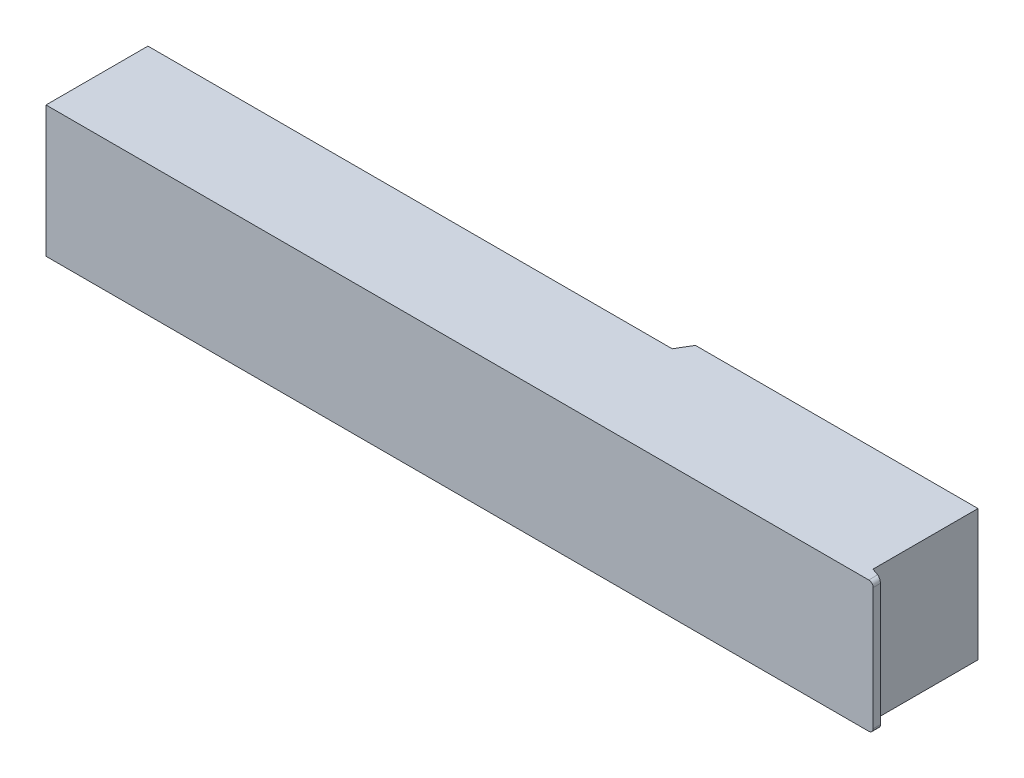
ISO-10303-21;
HEADER;
FILE_DESCRIPTION(('STEP AP214'),'2;1');
FILE_NAME('part.step','',(''),(''),'','','');
FILE_SCHEMA(('AUTOMOTIVE_DESIGN { 1 0 10303 214 1 1 1 1 }'));
ENDSEC;
DATA;
#1=APPLICATION_CONTEXT('core data for automotive mechanical design processes');
#2=APPLICATION_PROTOCOL_DEFINITION('international standard','automotive_design',2000,#1);
#3=PRODUCT_CONTEXT('',#1,'mechanical');
#4=PRODUCT('Part','Part','',(#3));
#5=PRODUCT_RELATED_PRODUCT_CATEGORY('part','',(#4));
#6=PRODUCT_DEFINITION_FORMATION('','',#4);
#7=PRODUCT_DEFINITION_CONTEXT('part definition',#1,'design');
#8=PRODUCT_DEFINITION('design','',#6,#7);
#9=PRODUCT_DEFINITION_SHAPE('','',#8);
#10=(LENGTH_UNIT() NAMED_UNIT(*) SI_UNIT(.MILLI.,.METRE.));
#11=(NAMED_UNIT(*) PLANE_ANGLE_UNIT() SI_UNIT($,.RADIAN.));
#12=(NAMED_UNIT(*) SI_UNIT($,.STERADIAN.) SOLID_ANGLE_UNIT());
#13=UNCERTAINTY_MEASURE_WITH_UNIT(LENGTH_MEASURE(1.E-05),#10,'distance_accuracy_value','');
#14=(GEOMETRIC_REPRESENTATION_CONTEXT(3) GLOBAL_UNCERTAINTY_ASSIGNED_CONTEXT((#13)) GLOBAL_UNIT_ASSIGNED_CONTEXT((#10,
#11,#12)) REPRESENTATION_CONTEXT('',''));
#15=CARTESIAN_POINT('',(0.,0.,0.));
#16=DIRECTION('',(0.,0.,1.));
#17=DIRECTION('',(1.,0.,0.));
#18=AXIS2_PLACEMENT_3D('',#15,#16,#17);
#19=CARTESIAN_POINT('',(0.,22.5,-20.));
#20=DIRECTION('',(0.,-1.,0.));
#21=DIRECTION('',(1.,0.,0.));
#22=AXIS2_PLACEMENT_3D('',#19,#20,#21);
#23=PLANE('',#22);
#24=DIRECTION('',(1.,0.,0.));
#25=VECTOR('',#24,1.);
#26=CARTESIAN_POINT('',(0.,22.5,-17.5));
#27=LINE('',#26,#25);
#28=CARTESIAN_POINT('',(0.,22.5,-17.5));
#29=VERTEX_POINT('',#28);
#30=CARTESIAN_POINT('',(90.,22.5,-17.5));
#31=VERTEX_POINT('',#30);
#32=EDGE_CURVE('E125',#29,#31,#27,.T.);
#33=ORIENTED_EDGE('',*,*,#32,.F.);
#34=DIRECTION('',(0.,0.,1.));
#35=VECTOR('',#34,1.);
#36=CARTESIAN_POINT('',(0.,22.5,-20.));
#37=LINE('',#36,#35);
#38=CARTESIAN_POINT('',(0.,22.5,0.));
#39=VERTEX_POINT('',#38);
#40=EDGE_CURVE('E181',#29,#39,#37,.T.);
#41=ORIENTED_EDGE('',*,*,#40,.T.);
#42=DIRECTION('',(1.,0.,0.));
#43=VECTOR('',#42,1.);
#44=CARTESIAN_POINT('',(0.,22.5,0.));
#45=LINE('',#44,#43);
#46=CARTESIAN_POINT('',(141.25,22.5,0.));
#47=VERTEX_POINT('',#46);
#48=EDGE_CURVE('E169',#39,#47,#45,.T.);
#49=ORIENTED_EDGE('',*,*,#48,.T.);
#50=DIRECTION('',(0.,0.,1.));
#51=VECTOR('',#50,1.);
#52=CARTESIAN_POINT('',(141.25,22.5,-1.24999999999999));
#53=LINE('',#52,#51);
#54=CARTESIAN_POINT('',(141.25,22.5,-1.52297767569964));
#55=VERTEX_POINT('',#54);
#56=EDGE_CURVE('E70',#47,#55,#53,.F.);
#57=ORIENTED_EDGE('',*,*,#56,.T.);
#58=DIRECTION('',(0.939692620785909,0.,0.342020143325667));
#59=VECTOR('',#58,1.);
#60=CARTESIAN_POINT('',(142.,22.5,-1.24999999999999));
#61=LINE('',#60,#59);
#62=CARTESIAN_POINT('',(140.,22.5,-1.97794046853239));
#63=VERTEX_POINT('',#62);
#64=EDGE_CURVE('E188',#55,#63,#61,.F.);
#65=ORIENTED_EDGE('',*,*,#64,.T.);
#66=DIRECTION('',(0.,0.,1.));
#67=VECTOR('',#66,1.);
#68=CARTESIAN_POINT('',(140.,22.5,-20.));
#69=LINE('',#68,#67);
#70=CARTESIAN_POINT('',(140.,22.5,-20.));
#71=VERTEX_POINT('',#70);
#72=EDGE_CURVE('E150',#71,#63,#69,.T.);
#73=ORIENTED_EDGE('',*,*,#72,.F.);
#74=DIRECTION('',(1.,0.,0.));
#75=VECTOR('',#74,1.);
#76=CARTESIAN_POINT('',(0.,22.5,-20.));
#77=LINE('',#76,#75);
#78=CARTESIAN_POINT('',(91.5,22.5,-20.));
#79=VERTEX_POINT('',#78);
#80=EDGE_CURVE('E142',#79,#71,#77,.T.);
#81=ORIENTED_EDGE('',*,*,#80,.F.);
#82=DIRECTION('',(0.51449575542753,0.,-0.857492925712542));
#83=VECTOR('',#82,1.);
#84=CARTESIAN_POINT('',(67.2794117647055,22.5,20.3676470588237));
#85=LINE('',#84,#83);
#86=EDGE_CURVE('E135',#31,#79,#85,.T.);
#87=ORIENTED_EDGE('',*,*,#86,.F.);
#88=EDGE_LOOP('',(#33,#41,#49,#57,#65,#73,#81,#87));
#89=FACE_BOUND('',#88,.T.);
#90=ADVANCED_FACE('F46',(#89),#23,.F.);
#91=CARTESIAN_POINT('',(0.,0.,-20.));
#92=DIRECTION('',(0.,-1.,0.));
#93=DIRECTION('',(1.,0.,0.));
#94=AXIS2_PLACEMENT_3D('',#91,#92,#93);
#95=PLANE('',#94);
#96=DIRECTION('',(0.,0.,1.));
#97=VECTOR('',#96,1.);
#98=CARTESIAN_POINT('',(0.,0.,-20.));
#99=LINE('',#98,#97);
#100=CARTESIAN_POINT('',(0.,0.,-17.5));
#101=VERTEX_POINT('',#100);
#102=CARTESIAN_POINT('',(0.,0.,0.));
#103=VERTEX_POINT('',#102);
#104=EDGE_CURVE('E165',#101,#103,#99,.T.);
#105=ORIENTED_EDGE('',*,*,#104,.F.);
#106=DIRECTION('',(1.,0.,0.));
#107=VECTOR('',#106,1.);
#108=CARTESIAN_POINT('',(0.,0.,-17.5));
#109=LINE('',#108,#107);
#110=CARTESIAN_POINT('',(90.,0.,-17.5));
#111=VERTEX_POINT('',#110);
#112=EDGE_CURVE('E11',#101,#111,#109,.T.);
#113=ORIENTED_EDGE('',*,*,#112,.T.);
#114=DIRECTION('',(0.51449575542753,0.,-0.857492925712542));
#115=VECTOR('',#114,1.);
#116=CARTESIAN_POINT('',(67.2794117647055,0.,20.3676470588237));
#117=LINE('',#116,#115);
#118=CARTESIAN_POINT('',(91.5,0.,-20.));
#119=VERTEX_POINT('',#118);
#120=EDGE_CURVE('E55',#111,#119,#117,.T.);
#121=ORIENTED_EDGE('',*,*,#120,.T.);
#122=DIRECTION('',(1.,0.,0.));
#123=VECTOR('',#122,1.);
#124=CARTESIAN_POINT('',(0.,0.,-20.));
#125=LINE('',#124,#123);
#126=CARTESIAN_POINT('',(140.,0.,-20.));
#127=VERTEX_POINT('',#126);
#128=EDGE_CURVE('E161',#119,#127,#125,.T.);
#129=ORIENTED_EDGE('',*,*,#128,.T.);
#130=DIRECTION('',(0.,0.,1.));
#131=VECTOR('',#130,1.);
#132=CARTESIAN_POINT('',(140.,0.,-20.));
#133=LINE('',#132,#131);
#134=CARTESIAN_POINT('',(140.,0.,-1.97794046853239));
#135=VERTEX_POINT('',#134);
#136=EDGE_CURVE('E134',#127,#135,#133,.T.);
#137=ORIENTED_EDGE('',*,*,#136,.T.);
#138=DIRECTION('',(-0.939692620785909,0.,-0.342020143325667));
#139=VECTOR('',#138,1.);
#140=CARTESIAN_POINT('',(10.5847106977411,0.,-49.0812536335036));
#141=LINE('',#140,#139);
#142=CARTESIAN_POINT('',(141.25,0.,-1.52297767569964));
#143=VERTEX_POINT('',#142);
#144=EDGE_CURVE('E191',#135,#143,#141,.F.);
#145=ORIENTED_EDGE('',*,*,#144,.T.);
#146=DIRECTION('',(0.,0.,1.));
#147=VECTOR('',#146,1.);
#148=CARTESIAN_POINT('',(141.25,0.,-20.));
#149=LINE('',#148,#147);
#150=CARTESIAN_POINT('',(141.25,0.,0.));
#151=VERTEX_POINT('',#150);
#152=EDGE_CURVE('E199',#143,#151,#149,.T.);
#153=ORIENTED_EDGE('',*,*,#152,.T.);
#154=DIRECTION('',(1.,0.,0.));
#155=VECTOR('',#154,1.);
#156=CARTESIAN_POINT('',(0.,0.,0.));
#157=LINE('',#156,#155);
#158=EDGE_CURVE('E162',#103,#151,#157,.T.);
#159=ORIENTED_EDGE('',*,*,#158,.F.);
#160=EDGE_LOOP('',(#105,#113,#121,#129,#137,#145,#153,#159));
#161=FACE_BOUND('',#160,.T.);
#162=ADVANCED_FACE('F227',(#161),#95,.T.);
#163=CARTESIAN_POINT('',(142.,0.,-20.));
#164=DIRECTION('',(1.,0.,0.));
#165=DIRECTION('',(0.,0.,-1.));
#166=AXIS2_PLACEMENT_3D('',#163,#164,#165);
#167=PLANE('',#166);
#168=DIRECTION('',(0.,1.,0.));
#169=VECTOR('',#168,1.);
#170=CARTESIAN_POINT('',(142.,0.,0.));
#171=LINE('',#170,#169);
#172=CARTESIAN_POINT('',(142.,0.750000000000017,0.));
#173=VERTEX_POINT('',#172);
#174=CARTESIAN_POINT('',(142.,21.75,0.));
#175=VERTEX_POINT('',#174);
#176=EDGE_CURVE('E172',#173,#175,#171,.T.);
#177=ORIENTED_EDGE('',*,*,#176,.F.);
#178=DIRECTION('',(0.,0.,1.));
#179=VECTOR('',#178,1.);
#180=CARTESIAN_POINT('',(142.,0.750000000000017,-20.));
#181=LINE('',#180,#179);
#182=CARTESIAN_POINT('',(142.,0.750000000000017,-1.24999999999999));
#183=VERTEX_POINT('',#182);
#184=EDGE_CURVE('E213',#173,#183,#181,.F.);
#185=ORIENTED_EDGE('',*,*,#184,.T.);
#186=DIRECTION('',(0.,1.,0.));
#187=VECTOR('',#186,1.);
#188=CARTESIAN_POINT('',(142.,0.,-1.24999999999999));
#189=LINE('',#188,#187);
#190=CARTESIAN_POINT('',(142.,21.75,-1.24999999999999));
#191=VERTEX_POINT('',#190);
#192=EDGE_CURVE('E184',#183,#191,#189,.T.);
#193=ORIENTED_EDGE('',*,*,#192,.T.);
#194=DIRECTION('',(0.,0.,1.));
#195=VECTOR('',#194,1.);
#196=CARTESIAN_POINT('',(142.,21.75,0.));
#197=LINE('',#196,#195);
#198=EDGE_CURVE('E209',#191,#175,#197,.T.);
#199=ORIENTED_EDGE('',*,*,#198,.T.);
#200=EDGE_LOOP('',(#177,#185,#193,#199));
#201=FACE_BOUND('',#200,.T.);
#202=ADVANCED_FACE('F244',(#201),#167,.T.);
#203=CARTESIAN_POINT('',(0.,0.,-20.));
#204=DIRECTION('',(1.,0.,0.));
#205=DIRECTION('',(0.,0.,-1.));
#206=AXIS2_PLACEMENT_3D('',#203,#204,#205);
#207=PLANE('',#206);
#208=ORIENTED_EDGE('',*,*,#40,.F.);
#209=DIRECTION('',(0.,-1.,0.));
#210=VECTOR('',#209,1.);
#211=CARTESIAN_POINT('',(0.,203.944938273295,-17.5));
#212=LINE('',#211,#210);
#213=EDGE_CURVE('E130',#29,#101,#212,.T.);
#214=ORIENTED_EDGE('',*,*,#213,.T.);
#215=ORIENTED_EDGE('',*,*,#104,.T.);
#216=DIRECTION('',(0.,1.,0.));
#217=VECTOR('',#216,1.);
#218=CARTESIAN_POINT('',(0.,0.,0.));
#219=LINE('',#218,#217);
#220=EDGE_CURVE('E158',#103,#39,#219,.T.);
#221=ORIENTED_EDGE('',*,*,#220,.T.);
#222=EDGE_LOOP('',(#208,#214,#215,#221));
#223=FACE_BOUND('',#222,.T.);
#224=ADVANCED_FACE('F256',(#223),#207,.F.);
#225=CARTESIAN_POINT('',(0.,0.,-20.));
#226=DIRECTION('',(0.,0.,-1.));
#227=DIRECTION('',(-1.,0.,0.));
#228=AXIS2_PLACEMENT_3D('',#225,#226,#227);
#229=PLANE('',#228);
#230=DIRECTION('',(0.,-1.,0.));
#231=VECTOR('',#230,1.);
#232=CARTESIAN_POINT('',(91.5,203.944938273295,-20.));
#233=LINE('',#232,#231);
#234=EDGE_CURVE('E62',#79,#119,#233,.T.);
#235=ORIENTED_EDGE('',*,*,#234,.F.);
#236=ORIENTED_EDGE('',*,*,#80,.T.);
#237=DIRECTION('',(0.,1.,0.));
#238=VECTOR('',#237,1.);
#239=CARTESIAN_POINT('',(140.,0.,-20.));
#240=LINE('',#239,#238);
#241=EDGE_CURVE('E154',#127,#71,#240,.T.);
#242=ORIENTED_EDGE('',*,*,#241,.F.);
#243=ORIENTED_EDGE('',*,*,#128,.F.);
#244=EDGE_LOOP('',(#235,#236,#242,#243));
#245=FACE_BOUND('',#244,.T.);
#246=ADVANCED_FACE('F231',(#245),#229,.T.);
#247=CARTESIAN_POINT('',(0.,0.,0.));
#248=DIRECTION('',(0.,0.,-1.));
#249=DIRECTION('',(-1.,0.,0.));
#250=AXIS2_PLACEMENT_3D('',#247,#248,#249);
#251=PLANE('',#250);
#252=ORIENTED_EDGE('',*,*,#158,.T.);
#253=CARTESIAN_POINT('',(141.25,0.750000000000017,0.));
#254=DIRECTION('',(0.,0.,-1.));
#255=DIRECTION('',(-1.,0.,0.));
#256=AXIS2_PLACEMENT_3D('',#253,#254,#255);
#257=CIRCLE('',#256,0.75);
#258=EDGE_CURVE('E206',#151,#173,#257,.F.);
#259=ORIENTED_EDGE('',*,*,#258,.T.);
#260=ORIENTED_EDGE('',*,*,#176,.T.);
#261=CARTESIAN_POINT('',(141.25,21.75,0.));
#262=DIRECTION('',(0.,0.,-1.));
#263=DIRECTION('',(-1.,0.,0.));
#264=AXIS2_PLACEMENT_3D('',#261,#262,#263);
#265=CIRCLE('',#264,0.75);
#266=EDGE_CURVE('E203',#175,#47,#265,.F.);
#267=ORIENTED_EDGE('',*,*,#266,.T.);
#268=ORIENTED_EDGE('',*,*,#48,.F.);
#269=ORIENTED_EDGE('',*,*,#220,.F.);
#270=EDGE_LOOP('',(#252,#259,#260,#267,#268,#269));
#271=FACE_BOUND('',#270,.T.);
#272=ADVANCED_FACE('F247',(#271),#251,.F.);
#273=CARTESIAN_POINT('',(140.,0.,0.));
#274=DIRECTION('',(-1.,0.,0.));
#275=DIRECTION('',(0.,0.,1.));
#276=AXIS2_PLACEMENT_3D('',#273,#274,#275);
#277=PLANE('',#276);
#278=ORIENTED_EDGE('',*,*,#136,.F.);
#279=ORIENTED_EDGE('',*,*,#241,.T.);
#280=ORIENTED_EDGE('',*,*,#72,.T.);
#281=DIRECTION('',(0.,1.,0.));
#282=VECTOR('',#281,1.);
#283=CARTESIAN_POINT('',(140.,0.,-1.97794046853239));
#284=LINE('',#283,#282);
#285=EDGE_CURVE('E195',#63,#135,#284,.F.);
#286=ORIENTED_EDGE('',*,*,#285,.T.);
#287=EDGE_LOOP('',(#278,#279,#280,#286));
#288=FACE_BOUND('',#287,.T.);
#289=ADVANCED_FACE('F233',(#288),#277,.F.);
#290=CARTESIAN_POINT('',(142.,0.,-1.24999999999999));
#291=DIRECTION('',(-0.342020143325667,0.,0.939692620785909));
#292=DIRECTION('',(0.,1.,0.));
#293=AXIS2_PLACEMENT_3D('',#290,#291,#292);
#294=PLANE('',#293);
#295=ORIENTED_EDGE('',*,*,#192,.F.);
#296=CARTESIAN_POINT('',(141.25,0.750000000000017,-1.52297767569964));
#297=DIRECTION('',(-0.342020143325667,0.,0.939692620785909));
#298=DIRECTION('',(0.939692620785909,0.,0.342020143325667));
#299=AXIS2_PLACEMENT_3D('',#296,#297,#298);
#300=ELLIPSE('',#299,0.798133329356934,0.75);
#301=EDGE_CURVE('E219',#183,#143,#300,.F.);
#302=ORIENTED_EDGE('',*,*,#301,.T.);
#303=ORIENTED_EDGE('',*,*,#144,.F.);
#304=ORIENTED_EDGE('',*,*,#285,.F.);
#305=ORIENTED_EDGE('',*,*,#64,.F.);
#306=CARTESIAN_POINT('',(141.25,21.75,-1.52297767569964));
#307=DIRECTION('',(-0.342020143325667,0.,0.939692620785909));
#308=DIRECTION('',(-0.939692620785909,0.,-0.342020143325667));
#309=AXIS2_PLACEMENT_3D('',#306,#307,#308);
#310=ELLIPSE('',#309,0.798133329356934,0.75);
#311=EDGE_CURVE('E216',#55,#191,#310,.F.);
#312=ORIENTED_EDGE('',*,*,#311,.T.);
#313=EDGE_LOOP('',(#295,#302,#303,#304,#305,#312));
#314=FACE_BOUND('',#313,.T.);
#315=ADVANCED_FACE('F238',(#314),#294,.F.);
#316=CARTESIAN_POINT('',(141.25,0.750000000000017,-20.));
#317=DIRECTION('',(0.,0.,1.));
#318=DIRECTION('',(1.,0.,0.));
#319=AXIS2_PLACEMENT_3D('',#316,#317,#318);
#320=CYLINDRICAL_SURFACE('',#319,0.75);
#321=ORIENTED_EDGE('',*,*,#301,.F.);
#322=ORIENTED_EDGE('',*,*,#184,.F.);
#323=ORIENTED_EDGE('',*,*,#258,.F.);
#324=ORIENTED_EDGE('',*,*,#152,.F.);
#325=EDGE_LOOP('',(#321,#322,#323,#324));
#326=FACE_BOUND('',#325,.T.);
#327=ADVANCED_FACE('F254',(#326),#320,.T.);
#328=CARTESIAN_POINT('',(141.25,21.75,-20.));
#329=DIRECTION('',(0.,0.,-1.));
#330=DIRECTION('',(-1.,0.,0.));
#331=AXIS2_PLACEMENT_3D('',#328,#329,#330);
#332=CYLINDRICAL_SURFACE('',#331,0.75);
#333=ORIENTED_EDGE('',*,*,#311,.F.);
#334=ORIENTED_EDGE('',*,*,#56,.F.);
#335=ORIENTED_EDGE('',*,*,#266,.F.);
#336=ORIENTED_EDGE('',*,*,#198,.F.);
#337=EDGE_LOOP('',(#333,#334,#335,#336));
#338=FACE_BOUND('',#337,.T.);
#339=ADVANCED_FACE('F48',(#338),#332,.T.);
#340=CARTESIAN_POINT('',(90.,203.944938273295,-17.5));
#341=DIRECTION('',(0.,0.,-1.));
#342=DIRECTION('',(-1.,0.,0.));
#343=AXIS2_PLACEMENT_3D('',#340,#341,#342);
#344=PLANE('',#343);
#345=ORIENTED_EDGE('',*,*,#213,.F.);
#346=ORIENTED_EDGE('',*,*,#32,.T.);
#347=DIRECTION('',(0.,-1.,0.));
#348=VECTOR('',#347,1.);
#349=CARTESIAN_POINT('',(90.,203.944938273295,-17.5));
#350=LINE('',#349,#348);
#351=EDGE_CURVE('E128',#31,#111,#350,.T.);
#352=ORIENTED_EDGE('',*,*,#351,.T.);
#353=ORIENTED_EDGE('',*,*,#112,.F.);
#354=EDGE_LOOP('',(#345,#346,#352,#353));
#355=FACE_BOUND('',#354,.T.);
#356=ADVANCED_FACE('F127',(#355),#344,.T.);
#357=CARTESIAN_POINT('',(90.,203.944938273295,-17.5));
#358=DIRECTION('',(-0.857492925712542,0.,-0.51449575542753));
#359=DIRECTION('',(-0.51449575542753,0.,0.857492925712542));
#360=AXIS2_PLACEMENT_3D('',#357,#358,#359);
#361=PLANE('',#360);
#362=ORIENTED_EDGE('',*,*,#351,.F.);
#363=ORIENTED_EDGE('',*,*,#86,.T.);
#364=ORIENTED_EDGE('',*,*,#234,.T.);
#365=ORIENTED_EDGE('',*,*,#120,.F.);
#366=EDGE_LOOP('',(#362,#363,#364,#365));
#367=FACE_BOUND('',#366,.T.);
#368=ADVANCED_FACE('F137',(#367),#361,.T.);
#369=CLOSED_SHELL('',(#90,#162,#202,#224,#246,#272,#289,#315,#327,#339,#356,#368));
#370=MANIFOLD_SOLID_BREP('B2',#369);
#371=ADVANCED_BREP_SHAPE_REPRESENTATION('',(#18,#370),#14);
#372=SHAPE_DEFINITION_REPRESENTATION(#9,#371);
ENDSEC;
END-ISO-10303-21;
